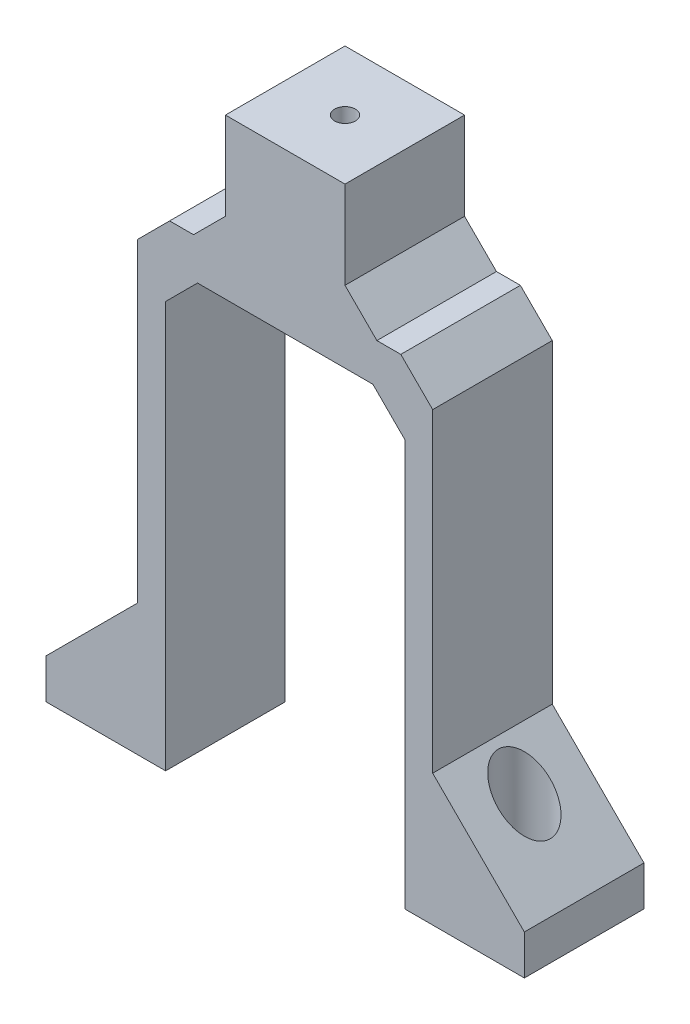
ISO-10303-21;
HEADER;
FILE_DESCRIPTION(('STEP AP214'),'2;1');
FILE_NAME('part.step','',(''),(''),'','','');
FILE_SCHEMA(('AUTOMOTIVE_DESIGN { 1 0 10303 214 1 1 1 1 }'));
ENDSEC;
DATA;
#1=APPLICATION_CONTEXT('core data for automotive mechanical design processes');
#2=APPLICATION_PROTOCOL_DEFINITION('international standard','automotive_design',2000,#1);
#3=PRODUCT_CONTEXT('',#1,'mechanical');
#4=PRODUCT('Part','Part','',(#3));
#5=PRODUCT_RELATED_PRODUCT_CATEGORY('part','',(#4));
#6=PRODUCT_DEFINITION_FORMATION('','',#4);
#7=PRODUCT_DEFINITION_CONTEXT('part definition',#1,'design');
#8=PRODUCT_DEFINITION('design','',#6,#7);
#9=PRODUCT_DEFINITION_SHAPE('','',#8);
#10=(LENGTH_UNIT() NAMED_UNIT(*) SI_UNIT(.MILLI.,.METRE.));
#11=(NAMED_UNIT(*) PLANE_ANGLE_UNIT() SI_UNIT($,.RADIAN.));
#12=(NAMED_UNIT(*) SI_UNIT($,.STERADIAN.) SOLID_ANGLE_UNIT());
#13=UNCERTAINTY_MEASURE_WITH_UNIT(LENGTH_MEASURE(1.E-05),#10,'distance_accuracy_value','');
#14=(GEOMETRIC_REPRESENTATION_CONTEXT(3) GLOBAL_UNCERTAINTY_ASSIGNED_CONTEXT((#13)) GLOBAL_UNIT_ASSIGNED_CONTEXT((#10,
#11,#12)) REPRESENTATION_CONTEXT('',''));
#15=CARTESIAN_POINT('',(0.,0.,0.));
#16=DIRECTION('',(0.,0.,1.));
#17=DIRECTION('',(1.,0.,0.));
#18=AXIS2_PLACEMENT_3D('',#15,#16,#17);
#19=CARTESIAN_POINT('',(-22.5,5.,0.));
#20=DIRECTION('',(0.,-1.,0.));
#21=DIRECTION('',(0.,0.,-1.));
#22=AXIS2_PLACEMENT_3D('',#19,#20,#21);
#23=CYLINDRICAL_SURFACE('',#22,1.875);
#24=CARTESIAN_POINT('',(-22.5,0.,0.));
#25=DIRECTION('',(0.,1.,0.));
#26=DIRECTION('',(0.,0.,1.));
#27=AXIS2_PLACEMENT_3D('',#24,#25,#26);
#28=CIRCLE('',#27,1.875);
#29=CARTESIAN_POINT('',(-22.5,0.,1.875));
#30=VERTEX_POINT('',#29);
#31=EDGE_CURVE('E295',#30,#30,#28,.T.);
#32=ORIENTED_EDGE('',*,*,#31,.F.);
#33=EDGE_LOOP('',(#32));
#34=FACE_BOUND('',#33,.T.);
#35=CARTESIAN_POINT('',(-22.5,3.,0.));
#36=DIRECTION('',(0.,1.,0.));
#37=DIRECTION('',(0.,0.,1.));
#38=AXIS2_PLACEMENT_3D('',#35,#36,#37);
#39=CIRCLE('',#38,1.875);
#40=CARTESIAN_POINT('',(-22.5,3.,1.875));
#41=VERTEX_POINT('',#40);
#42=EDGE_CURVE('E411',#41,#41,#39,.T.);
#43=ORIENTED_EDGE('',*,*,#42,.T.);
#44=EDGE_LOOP('',(#43));
#45=FACE_BOUND('',#44,.T.);
#46=ADVANCED_FACE('F41',(#34,#45),#23,.F.);
#47=CARTESIAN_POINT('',(22.5,5.,0.));
#48=DIRECTION('',(0.,-1.,0.));
#49=DIRECTION('',(0.,0.,-1.));
#50=AXIS2_PLACEMENT_3D('',#47,#48,#49);
#51=CYLINDRICAL_SURFACE('',#50,1.875);
#52=CARTESIAN_POINT('',(22.5,0.,0.));
#53=DIRECTION('',(0.,1.,0.));
#54=DIRECTION('',(0.,0.,1.));
#55=AXIS2_PLACEMENT_3D('',#52,#53,#54);
#56=CIRCLE('',#55,1.875);
#57=CARTESIAN_POINT('',(22.5,0.,1.875));
#58=VERTEX_POINT('',#57);
#59=EDGE_CURVE('E219',#58,#58,#56,.T.);
#60=ORIENTED_EDGE('',*,*,#59,.F.);
#61=EDGE_LOOP('',(#60));
#62=FACE_BOUND('',#61,.T.);
#63=CARTESIAN_POINT('',(22.5,3.,0.));
#64=DIRECTION('',(0.,1.,0.));
#65=DIRECTION('',(0.,0.,1.));
#66=AXIS2_PLACEMENT_3D('',#63,#64,#65);
#67=CIRCLE('',#66,1.875);
#68=CARTESIAN_POINT('',(22.5,3.,1.875));
#69=VERTEX_POINT('',#68);
#70=EDGE_CURVE('E407',#69,#69,#67,.T.);
#71=ORIENTED_EDGE('',*,*,#70,.T.);
#72=EDGE_LOOP('',(#71));
#73=FACE_BOUND('',#72,.T.);
#74=ADVANCED_FACE('F560',(#62,#73),#51,.F.);
#75=CARTESIAN_POINT('',(0.,60.,0.));
#76=DIRECTION('',(0.,-1.,0.));
#77=DIRECTION('',(0.,0.,-1.));
#78=AXIS2_PLACEMENT_3D('',#75,#76,#77);
#79=PLANE('',#78);
#80=DIRECTION('',(1.,0.,0.));
#81=VECTOR('',#80,1.);
#82=CARTESIAN_POINT('',(-18.5,60.,7.5));
#83=LINE('',#82,#81);
#84=CARTESIAN_POINT('',(11.5,60.,7.5));
#85=VERTEX_POINT('',#84);
#86=CARTESIAN_POINT('',(14.5,60.,7.5));
#87=VERTEX_POINT('',#86);
#88=EDGE_CURVE('E263',#85,#87,#83,.T.);
#89=ORIENTED_EDGE('',*,*,#88,.T.);
#90=DIRECTION('',(0.,0.,-1.));
#91=VECTOR('',#90,1.);
#92=CARTESIAN_POINT('',(14.5,60.,0.));
#93=LINE('',#92,#91);
#94=CARTESIAN_POINT('',(14.5,60.,-7.5));
#95=VERTEX_POINT('',#94);
#96=EDGE_CURVE('E355',#87,#95,#93,.T.);
#97=ORIENTED_EDGE('',*,*,#96,.T.);
#98=DIRECTION('',(-1.,0.,0.));
#99=VECTOR('',#98,1.);
#100=CARTESIAN_POINT('',(-18.5,60.,-7.5));
#101=LINE('',#100,#99);
#102=CARTESIAN_POINT('',(11.5,60.,-7.5));
#103=VERTEX_POINT('',#102);
#104=EDGE_CURVE('E269',#95,#103,#101,.T.);
#105=ORIENTED_EDGE('',*,*,#104,.T.);
#106=DIRECTION('',(0.,0.,1.));
#107=VECTOR('',#106,1.);
#108=CARTESIAN_POINT('',(11.5,60.,7.5));
#109=LINE('',#108,#107);
#110=EDGE_CURVE('E352',#103,#85,#109,.T.);
#111=ORIENTED_EDGE('',*,*,#110,.T.);
#112=EDGE_LOOP('',(#89,#97,#105,#111));
#113=FACE_BOUND('',#112,.T.);
#114=ADVANCED_FACE('F546',(#113),#79,.F.);
#115=CARTESIAN_POINT('',(-11.5,60.,-7.5));
#116=VERTEX_POINT('',#115);
#117=CARTESIAN_POINT('',(-14.5,60.,-7.5));
#118=VERTEX_POINT('',#117);
#119=EDGE_CURVE('E274',#116,#118,#101,.T.);
#120=ORIENTED_EDGE('',*,*,#119,.T.);
#121=DIRECTION('',(0.,0.,1.));
#122=VECTOR('',#121,1.);
#123=CARTESIAN_POINT('',(-14.5,60.,0.));
#124=LINE('',#123,#122);
#125=CARTESIAN_POINT('',(-14.5,60.,7.5));
#126=VERTEX_POINT('',#125);
#127=EDGE_CURVE('E333',#118,#126,#124,.T.);
#128=ORIENTED_EDGE('',*,*,#127,.T.);
#129=CARTESIAN_POINT('',(-11.5,60.,7.5));
#130=VERTEX_POINT('',#129);
#131=EDGE_CURVE('E267',#126,#130,#83,.T.);
#132=ORIENTED_EDGE('',*,*,#131,.T.);
#133=DIRECTION('',(0.,0.,-1.));
#134=VECTOR('',#133,1.);
#135=CARTESIAN_POINT('',(-11.5,60.,-7.5));
#136=LINE('',#135,#134);
#137=EDGE_CURVE('E330',#130,#116,#136,.T.);
#138=ORIENTED_EDGE('',*,*,#137,.T.);
#139=EDGE_LOOP('',(#120,#128,#132,#138));
#140=FACE_BOUND('',#139,.T.);
#141=ADVANCED_FACE('F474',(#140),#79,.F.);
#142=CARTESIAN_POINT('',(0.,55.,0.));
#143=DIRECTION('',(0.,-1.,0.));
#144=DIRECTION('',(0.,0.,-1.));
#145=AXIS2_PLACEMENT_3D('',#142,#143,#144);
#146=PLANE('',#145);
#147=CARTESIAN_POINT('',(0.,55.,0.));
#148=DIRECTION('',(0.,-1.,0.));
#149=DIRECTION('',(0.,0.,-1.));
#150=AXIS2_PLACEMENT_3D('',#147,#148,#149);
#151=CIRCLE('',#150,1.3);
#152=CARTESIAN_POINT('',(0.,55.,-1.3));
#153=VERTEX_POINT('',#152);
#154=EDGE_CURVE('E212',#153,#153,#151,.T.);
#155=ORIENTED_EDGE('',*,*,#154,.F.);
#156=EDGE_LOOP('',(#155));
#157=FACE_BOUND('',#156,.T.);
#158=DIRECTION('',(-1.,0.,0.));
#159=VECTOR('',#158,1.);
#160=CARTESIAN_POINT('',(-18.5,55.,-7.5));
#161=LINE('',#160,#159);
#162=CARTESIAN_POINT('',(11.,55.,-7.5));
#163=VERTEX_POINT('',#162);
#164=CARTESIAN_POINT('',(-11.,55.,-7.5));
#165=VERTEX_POINT('',#164);
#166=EDGE_CURVE('E268',#163,#165,#161,.T.);
#167=ORIENTED_EDGE('',*,*,#166,.F.);
#168=DIRECTION('',(0.,0.,1.));
#169=VECTOR('',#168,1.);
#170=CARTESIAN_POINT('',(11.,55.,0.));
#171=LINE('',#170,#169);
#172=CARTESIAN_POINT('',(11.,55.,7.5));
#173=VERTEX_POINT('',#172);
#174=EDGE_CURVE('E368',#163,#173,#171,.T.);
#175=ORIENTED_EDGE('',*,*,#174,.T.);
#176=DIRECTION('',(1.,0.,0.));
#177=VECTOR('',#176,1.);
#178=CARTESIAN_POINT('',(-18.5,55.,7.5));
#179=LINE('',#178,#177);
#180=CARTESIAN_POINT('',(-11.,55.,7.5));
#181=VERTEX_POINT('',#180);
#182=EDGE_CURVE('E262',#181,#173,#179,.T.);
#183=ORIENTED_EDGE('',*,*,#182,.F.);
#184=DIRECTION('',(0.,0.,-1.));
#185=VECTOR('',#184,1.);
#186=CARTESIAN_POINT('',(-11.,55.,0.));
#187=LINE('',#186,#185);
#188=EDGE_CURVE('E364',#181,#165,#187,.T.);
#189=ORIENTED_EDGE('',*,*,#188,.T.);
#190=EDGE_LOOP('',(#167,#175,#183,#189));
#191=FACE_BOUND('',#190,.T.);
#192=ADVANCED_FACE('F509',(#157,#191),#146,.T.);
#193=CARTESIAN_POINT('',(0.,0.,0.));
#194=DIRECTION('',(0.,-1.,0.));
#195=DIRECTION('',(0.,0.,-1.));
#196=AXIS2_PLACEMENT_3D('',#193,#194,#195);
#197=PLANE('',#196);
#198=DIRECTION('',(0.,0.,-1.));
#199=VECTOR('',#198,1.);
#200=CARTESIAN_POINT('',(-15.,0.,7.5));
#201=LINE('',#200,#199);
#202=CARTESIAN_POINT('',(-15.,0.,7.5));
#203=VERTEX_POINT('',#202);
#204=CARTESIAN_POINT('',(-15.,0.,-7.5));
#205=VERTEX_POINT('',#204);
#206=EDGE_CURVE('E299',#203,#205,#201,.T.);
#207=ORIENTED_EDGE('',*,*,#206,.F.);
#208=DIRECTION('',(1.,0.,0.));
#209=VECTOR('',#208,1.);
#210=CARTESIAN_POINT('',(-30.,0.,7.5));
#211=LINE('',#210,#209);
#212=CARTESIAN_POINT('',(-30.,0.,7.5));
#213=VERTEX_POINT('',#212);
#214=EDGE_CURVE('E304',#213,#203,#211,.T.);
#215=ORIENTED_EDGE('',*,*,#214,.F.);
#216=DIRECTION('',(0.,0.,1.));
#217=VECTOR('',#216,1.);
#218=CARTESIAN_POINT('',(-30.,0.,7.5));
#219=LINE('',#218,#217);
#220=CARTESIAN_POINT('',(-30.,0.,-7.5));
#221=VERTEX_POINT('',#220);
#222=EDGE_CURVE('E311',#221,#213,#219,.T.);
#223=ORIENTED_EDGE('',*,*,#222,.F.);
#224=DIRECTION('',(-1.,0.,0.));
#225=VECTOR('',#224,1.);
#226=CARTESIAN_POINT('',(-30.,0.,-7.5));
#227=LINE('',#226,#225);
#228=EDGE_CURVE('E308',#205,#221,#227,.T.);
#229=ORIENTED_EDGE('',*,*,#228,.F.);
#230=EDGE_LOOP('',(#207,#215,#223,#229));
#231=FACE_BOUND('',#230,.T.);
#232=ORIENTED_EDGE('',*,*,#31,.T.);
#233=EDGE_LOOP('',(#232));
#234=FACE_BOUND('',#233,.T.);
#235=ADVANCED_FACE('F495',(#231,#234),#197,.T.);
#236=CARTESIAN_POINT('',(-15.,5.,7.5));
#237=DIRECTION('',(-1.,0.,0.));
#238=DIRECTION('',(0.,0.,1.));
#239=AXIS2_PLACEMENT_3D('',#236,#237,#238);
#240=PLANE('',#239);
#241=DIRECTION('',(0.,-1.,0.));
#242=VECTOR('',#241,1.);
#243=CARTESIAN_POINT('',(-15.,5.,-7.5));
#244=LINE('',#243,#242);
#245=CARTESIAN_POINT('',(-15.,51.,-7.5));
#246=VERTEX_POINT('',#245);
#247=EDGE_CURVE('E327',#246,#205,#244,.T.);
#248=ORIENTED_EDGE('',*,*,#247,.F.);
#249=DIRECTION('',(0.,0.,1.));
#250=VECTOR('',#249,1.);
#251=CARTESIAN_POINT('',(-15.,51.,7.5));
#252=LINE('',#251,#250);
#253=CARTESIAN_POINT('',(-15.,51.,7.5));
#254=VERTEX_POINT('',#253);
#255=EDGE_CURVE('E375',#246,#254,#252,.T.);
#256=ORIENTED_EDGE('',*,*,#255,.T.);
#257=DIRECTION('',(0.,-1.,0.));
#258=VECTOR('',#257,1.);
#259=CARTESIAN_POINT('',(-15.,5.,7.5));
#260=LINE('',#259,#258);
#261=EDGE_CURVE('E303',#254,#203,#260,.T.);
#262=ORIENTED_EDGE('',*,*,#261,.T.);
#263=ORIENTED_EDGE('',*,*,#206,.T.);
#264=EDGE_LOOP('',(#248,#256,#262,#263));
#265=FACE_BOUND('',#264,.T.);
#266=ADVANCED_FACE('F500',(#265),#240,.F.);
#267=CARTESIAN_POINT('',(-30.,5.,-7.5));
#268=DIRECTION('',(0.,0.,1.));
#269=DIRECTION('',(1.,0.,0.));
#270=AXIS2_PLACEMENT_3D('',#267,#268,#269);
#271=PLANE('',#270);
#272=DIRECTION('',(0.,-1.,0.));
#273=VECTOR('',#272,1.);
#274=CARTESIAN_POINT('',(-18.5,55.,-7.5));
#275=LINE('',#274,#273);
#276=CARTESIAN_POINT('',(-18.5,56.,-7.5));
#277=VERTEX_POINT('',#276);
#278=CARTESIAN_POINT('',(-18.5,16.5000000000001,-7.5));
#279=VERTEX_POINT('',#278);
#280=EDGE_CURVE('E292',#277,#279,#275,.T.);
#281=ORIENTED_EDGE('',*,*,#280,.F.);
#282=DIRECTION('',(-0.707106781186546,-0.707106781186549,0.));
#283=VECTOR('',#282,1.);
#284=CARTESIAN_POINT('',(-14.5,60.,-7.5));
#285=LINE('',#284,#283);
#286=EDGE_CURVE('E349',#277,#118,#285,.F.);
#287=ORIENTED_EDGE('',*,*,#286,.T.);
#288=ORIENTED_EDGE('',*,*,#119,.F.);
#289=DIRECTION('',(-0.707106781186544,-0.707106781186551,0.));
#290=VECTOR('',#289,1.);
#291=CARTESIAN_POINT('',(-48.2499999999999,23.2499999999997,-7.5));
#292=LINE('',#291,#290);
#293=CARTESIAN_POINT('',(-7.5,64.,-7.5));
#294=VERTEX_POINT('',#293);
#295=EDGE_CURVE('E403',#116,#294,#292,.F.);
#296=ORIENTED_EDGE('',*,*,#295,.T.);
#297=DIRECTION('',(0.,-1.,0.));
#298=VECTOR('',#297,1.);
#299=CARTESIAN_POINT('',(-7.5,75.,-7.5));
#300=LINE('',#299,#298);
#301=CARTESIAN_POINT('',(-7.5,75.,-7.5));
#302=VERTEX_POINT('',#301);
#303=EDGE_CURVE('E197',#302,#294,#300,.T.);
#304=ORIENTED_EDGE('',*,*,#303,.F.);
#305=DIRECTION('',(-1.,0.,0.));
#306=VECTOR('',#305,1.);
#307=CARTESIAN_POINT('',(-7.5,75.,-7.5));
#308=LINE('',#307,#306);
#309=CARTESIAN_POINT('',(7.5,75.,-7.5));
#310=VERTEX_POINT('',#309);
#311=EDGE_CURVE('E191',#310,#302,#308,.T.);
#312=ORIENTED_EDGE('',*,*,#311,.F.);
#313=DIRECTION('',(0.,-1.,0.));
#314=VECTOR('',#313,1.);
#315=CARTESIAN_POINT('',(7.5,75.,-7.5));
#316=LINE('',#315,#314);
#317=CARTESIAN_POINT('',(7.5,64.,-7.5));
#318=VERTEX_POINT('',#317);
#319=EDGE_CURVE('E195',#310,#318,#316,.T.);
#320=ORIENTED_EDGE('',*,*,#319,.T.);
#321=DIRECTION('',(-0.707106781186544,0.707106781186551,0.));
#322=VECTOR('',#321,1.);
#323=CARTESIAN_POINT('',(18.2500000000002,53.2499999999997,-7.5));
#324=LINE('',#323,#322);
#325=EDGE_CURVE('E382',#318,#103,#324,.F.);
#326=ORIENTED_EDGE('',*,*,#325,.T.);
#327=ORIENTED_EDGE('',*,*,#104,.F.);
#328=DIRECTION('',(-0.707106781186546,0.707106781186549,0.));
#329=VECTOR('',#328,1.);
#330=CARTESIAN_POINT('',(14.5,60.,-7.5));
#331=LINE('',#330,#329);
#332=CARTESIAN_POINT('',(18.5,56.,-7.5));
#333=VERTEX_POINT('',#332);
#334=EDGE_CURVE('E346',#95,#333,#331,.F.);
#335=ORIENTED_EDGE('',*,*,#334,.T.);
#336=DIRECTION('',(0.,-1.,0.));
#337=VECTOR('',#336,1.);
#338=CARTESIAN_POINT('',(18.5,60.,-7.5));
#339=LINE('',#338,#337);
#340=CARTESIAN_POINT('',(18.5,16.5000000000001,-7.5));
#341=VERTEX_POINT('',#340);
#342=EDGE_CURVE('E273',#333,#341,#339,.T.);
#343=ORIENTED_EDGE('',*,*,#342,.T.);
#344=DIRECTION('',(-0.707106781186544,0.707106781186551,0.));
#345=VECTOR('',#344,1.);
#346=CARTESIAN_POINT('',(2.77555756156289E-13,35.,-7.5));
#347=LINE('',#346,#345);
#348=CARTESIAN_POINT('',(30.,5.,-7.5));
#349=VERTEX_POINT('',#348);
#350=EDGE_CURVE('E423',#341,#349,#347,.F.);
#351=ORIENTED_EDGE('',*,*,#350,.T.);
#352=DIRECTION('',(0.,-1.,0.));
#353=VECTOR('',#352,1.);
#354=CARTESIAN_POINT('',(30.,5.,-7.5));
#355=LINE('',#354,#353);
#356=CARTESIAN_POINT('',(30.,0.,-7.5));
#357=VERTEX_POINT('',#356);
#358=EDGE_CURVE('E258',#349,#357,#355,.T.);
#359=ORIENTED_EDGE('',*,*,#358,.T.);
#360=DIRECTION('',(-1.,0.,0.));
#361=VECTOR('',#360,1.);
#362=CARTESIAN_POINT('',(15.,0.,-7.5));
#363=LINE('',#362,#361);
#364=CARTESIAN_POINT('',(15.,0.,-7.5));
#365=VERTEX_POINT('',#364);
#366=EDGE_CURVE('E239',#357,#365,#363,.T.);
#367=ORIENTED_EDGE('',*,*,#366,.T.);
#368=DIRECTION('',(0.,-1.,0.));
#369=VECTOR('',#368,1.);
#370=CARTESIAN_POINT('',(15.,5.,-7.5));
#371=LINE('',#370,#369);
#372=CARTESIAN_POINT('',(15.,51.,-7.5));
#373=VERTEX_POINT('',#372);
#374=EDGE_CURVE('E255',#373,#365,#371,.T.);
#375=ORIENTED_EDGE('',*,*,#374,.F.);
#376=DIRECTION('',(-0.707106781186551,0.707106781186544,0.));
#377=VECTOR('',#376,1.);
#378=CARTESIAN_POINT('',(15.4999999999998,50.5000000000003,-7.5));
#379=LINE('',#378,#377);
#380=EDGE_CURVE('E391',#373,#163,#379,.T.);
#381=ORIENTED_EDGE('',*,*,#380,.T.);
#382=ORIENTED_EDGE('',*,*,#166,.T.);
#383=DIRECTION('',(-0.707106781186551,-0.707106781186544,0.));
#384=VECTOR('',#383,1.);
#385=CARTESIAN_POINT('',(-45.5000000000001,20.5000000000003,-7.5));
#386=LINE('',#385,#384);
#387=EDGE_CURVE('E394',#165,#246,#386,.T.);
#388=ORIENTED_EDGE('',*,*,#387,.T.);
#389=ORIENTED_EDGE('',*,*,#247,.T.);
#390=ORIENTED_EDGE('',*,*,#228,.T.);
#391=DIRECTION('',(0.,-1.,0.));
#392=VECTOR('',#391,1.);
#393=CARTESIAN_POINT('',(-30.,5.,-7.5));
#394=LINE('',#393,#392);
#395=CARTESIAN_POINT('',(-30.,5.,-7.5));
#396=VERTEX_POINT('',#395);
#397=EDGE_CURVE('E323',#396,#221,#394,.T.);
#398=ORIENTED_EDGE('',*,*,#397,.F.);
#399=DIRECTION('',(-0.707106781186544,-0.707106781186551,0.));
#400=VECTOR('',#399,1.);
#401=CARTESIAN_POINT('',(-30.,5.,-7.5));
#402=LINE('',#401,#400);
#403=EDGE_CURVE('E11',#396,#279,#402,.F.);
#404=ORIENTED_EDGE('',*,*,#403,.T.);
#405=EDGE_LOOP('',(#281,#287,#288,#296,#304,#312,#320,#326,#327,#335,#343,#351,#359,#367,#375,
#381,#382,#388,#389,#390,#398,#404));
#406=FACE_BOUND('',#405,.T.);
#407=ADVANCED_FACE('F193',(#406),#271,.F.);
#408=CARTESIAN_POINT('',(-30.,5.,7.5));
#409=DIRECTION('',(1.,0.,0.));
#410=DIRECTION('',(0.,0.,-1.));
#411=AXIS2_PLACEMENT_3D('',#408,#409,#410);
#412=PLANE('',#411);
#413=ORIENTED_EDGE('',*,*,#222,.T.);
#414=DIRECTION('',(0.,-1.,0.));
#415=VECTOR('',#414,1.);
#416=CARTESIAN_POINT('',(-30.,5.,7.5));
#417=LINE('',#416,#415);
#418=CARTESIAN_POINT('',(-30.,5.,7.5));
#419=VERTEX_POINT('',#418);
#420=EDGE_CURVE('E319',#419,#213,#417,.T.);
#421=ORIENTED_EDGE('',*,*,#420,.F.);
#422=DIRECTION('',(0.,0.,1.));
#423=VECTOR('',#422,1.);
#424=CARTESIAN_POINT('',(-30.,5.,7.5));
#425=LINE('',#424,#423);
#426=EDGE_CURVE('E300',#396,#419,#425,.T.);
#427=ORIENTED_EDGE('',*,*,#426,.F.);
#428=ORIENTED_EDGE('',*,*,#397,.T.);
#429=EDGE_LOOP('',(#413,#421,#427,#428));
#430=FACE_BOUND('',#429,.T.);
#431=ADVANCED_FACE('F489',(#430),#412,.F.);
#432=CARTESIAN_POINT('',(-30.,5.,7.5));
#433=DIRECTION('',(0.,0.,-1.));
#434=DIRECTION('',(-1.,0.,0.));
#435=AXIS2_PLACEMENT_3D('',#432,#433,#434);
#436=PLANE('',#435);
#437=ORIENTED_EDGE('',*,*,#131,.F.);
#438=DIRECTION('',(0.707106781186546,0.707106781186549,0.));
#439=VECTOR('',#438,1.);
#440=CARTESIAN_POINT('',(-14.5,60.,7.5));
#441=LINE('',#440,#439);
#442=CARTESIAN_POINT('',(-18.5,56.,7.5));
#443=VERTEX_POINT('',#442);
#444=EDGE_CURVE('E340',#126,#443,#441,.F.);
#445=ORIENTED_EDGE('',*,*,#444,.T.);
#446=DIRECTION('',(0.,-1.,0.));
#447=VECTOR('',#446,1.);
#448=CARTESIAN_POINT('',(-18.5,55.,7.5));
#449=LINE('',#448,#447);
#450=CARTESIAN_POINT('',(-18.5,16.5000000000001,7.5));
#451=VERTEX_POINT('',#450);
#452=EDGE_CURVE('E288',#443,#451,#449,.T.);
#453=ORIENTED_EDGE('',*,*,#452,.T.);
#454=DIRECTION('',(0.707106781186544,0.707106781186551,0.));
#455=VECTOR('',#454,1.);
#456=CARTESIAN_POINT('',(-30.,5.,7.5));
#457=LINE('',#456,#455);
#458=EDGE_CURVE('E51',#451,#419,#457,.F.);
#459=ORIENTED_EDGE('',*,*,#458,.T.);
#460=ORIENTED_EDGE('',*,*,#420,.T.);
#461=ORIENTED_EDGE('',*,*,#214,.T.);
#462=ORIENTED_EDGE('',*,*,#261,.F.);
#463=DIRECTION('',(0.707106781186551,0.707106781186544,0.));
#464=VECTOR('',#463,1.);
#465=CARTESIAN_POINT('',(-45.5000000000001,20.5000000000003,7.5));
#466=LINE('',#465,#464);
#467=EDGE_CURVE('E397',#254,#181,#466,.T.);
#468=ORIENTED_EDGE('',*,*,#467,.T.);
#469=ORIENTED_EDGE('',*,*,#182,.T.);
#470=DIRECTION('',(0.707106781186551,-0.707106781186544,0.));
#471=VECTOR('',#470,1.);
#472=CARTESIAN_POINT('',(15.4999999999998,50.5000000000003,7.5));
#473=LINE('',#472,#471);
#474=CARTESIAN_POINT('',(15.,51.,7.5));
#475=VERTEX_POINT('',#474);
#476=EDGE_CURVE('E388',#173,#475,#473,.T.);
#477=ORIENTED_EDGE('',*,*,#476,.T.);
#478=DIRECTION('',(0.,-1.,0.));
#479=VECTOR('',#478,1.);
#480=CARTESIAN_POINT('',(15.,5.,7.5));
#481=LINE('',#480,#479);
#482=CARTESIAN_POINT('',(15.,0.,7.5));
#483=VERTEX_POINT('',#482);
#484=EDGE_CURVE('E252',#475,#483,#481,.T.);
#485=ORIENTED_EDGE('',*,*,#484,.T.);
#486=DIRECTION('',(1.,0.,0.));
#487=VECTOR('',#486,1.);
#488=CARTESIAN_POINT('',(15.,0.,7.5));
#489=LINE('',#488,#487);
#490=CARTESIAN_POINT('',(30.,0.,7.5));
#491=VERTEX_POINT('',#490);
#492=EDGE_CURVE('E235',#483,#491,#489,.T.);
#493=ORIENTED_EDGE('',*,*,#492,.T.);
#494=DIRECTION('',(0.,-1.,0.));
#495=VECTOR('',#494,1.);
#496=CARTESIAN_POINT('',(30.,5.,7.5));
#497=LINE('',#496,#495);
#498=CARTESIAN_POINT('',(30.,5.,7.5));
#499=VERTEX_POINT('',#498);
#500=EDGE_CURVE('E234',#499,#491,#497,.T.);
#501=ORIENTED_EDGE('',*,*,#500,.F.);
#502=DIRECTION('',(0.707106781186544,-0.707106781186551,0.));
#503=VECTOR('',#502,1.);
#504=CARTESIAN_POINT('',(2.77555756156289E-13,35.,7.5));
#505=LINE('',#504,#503);
#506=CARTESIAN_POINT('',(18.5,16.5000000000001,7.5));
#507=VERTEX_POINT('',#506);
#508=EDGE_CURVE('E426',#499,#507,#505,.F.);
#509=ORIENTED_EDGE('',*,*,#508,.T.);
#510=DIRECTION('',(0.,-1.,0.));
#511=VECTOR('',#510,1.);
#512=CARTESIAN_POINT('',(18.5,60.,7.5));
#513=LINE('',#512,#511);
#514=CARTESIAN_POINT('',(18.5,56.,7.5));
#515=VERTEX_POINT('',#514);
#516=EDGE_CURVE('E284',#515,#507,#513,.T.);
#517=ORIENTED_EDGE('',*,*,#516,.F.);
#518=DIRECTION('',(0.707106781186546,-0.707106781186549,0.));
#519=VECTOR('',#518,1.);
#520=CARTESIAN_POINT('',(14.5,60.,7.5));
#521=LINE('',#520,#519);
#522=EDGE_CURVE('E337',#515,#87,#521,.F.);
#523=ORIENTED_EDGE('',*,*,#522,.T.);
#524=ORIENTED_EDGE('',*,*,#88,.F.);
#525=DIRECTION('',(0.707106781186544,-0.707106781186551,0.));
#526=VECTOR('',#525,1.);
#527=CARTESIAN_POINT('',(18.2500000000002,53.2499999999997,7.5));
#528=LINE('',#527,#526);
#529=CARTESIAN_POINT('',(7.5,64.,7.5));
#530=VERTEX_POINT('',#529);
#531=EDGE_CURVE('E385',#85,#530,#528,.F.);
#532=ORIENTED_EDGE('',*,*,#531,.T.);
#533=DIRECTION('',(0.,-1.,0.));
#534=VECTOR('',#533,1.);
#535=CARTESIAN_POINT('',(7.5,75.,7.5));
#536=LINE('',#535,#534);
#537=CARTESIAN_POINT('',(7.5,75.,7.5));
#538=VERTEX_POINT('',#537);
#539=EDGE_CURVE('E455',#538,#530,#536,.T.);
#540=ORIENTED_EDGE('',*,*,#539,.F.);
#541=DIRECTION('',(1.,0.,0.));
#542=VECTOR('',#541,1.);
#543=CARTESIAN_POINT('',(-7.5,75.,7.5));
#544=LINE('',#543,#542);
#545=CARTESIAN_POINT('',(-7.5,75.,7.5));
#546=VERTEX_POINT('',#545);
#547=EDGE_CURVE('E207',#546,#538,#544,.T.);
#548=ORIENTED_EDGE('',*,*,#547,.F.);
#549=DIRECTION('',(0.,-1.,0.));
#550=VECTOR('',#549,1.);
#551=CARTESIAN_POINT('',(-7.5,75.,7.5));
#552=LINE('',#551,#550);
#553=CARTESIAN_POINT('',(-7.5,64.,7.5));
#554=VERTEX_POINT('',#553);
#555=EDGE_CURVE('E226',#546,#554,#552,.T.);
#556=ORIENTED_EDGE('',*,*,#555,.T.);
#557=DIRECTION('',(0.707106781186544,0.707106781186551,0.));
#558=VECTOR('',#557,1.);
#559=CARTESIAN_POINT('',(-48.2499999999999,23.2499999999997,7.5));
#560=LINE('',#559,#558);
#561=EDGE_CURVE('E400',#554,#130,#560,.F.);
#562=ORIENTED_EDGE('',*,*,#561,.T.);
#563=EDGE_LOOP('',(#437,#445,#453,#459,#460,#461,#462,#468,#469,#477,#485,#493,#501,#509,#517,
#523,#524,#532,#540,#548,#556,#562));
#564=FACE_BOUND('',#563,.T.);
#565=ADVANCED_FACE('F462',(#564),#436,.F.);
#566=CARTESIAN_POINT('',(-18.5,55.,-7.5));
#567=DIRECTION('',(1.,0.,0.));
#568=DIRECTION('',(0.,0.,-1.));
#569=AXIS2_PLACEMENT_3D('',#566,#567,#568);
#570=PLANE('',#569);
#571=ORIENTED_EDGE('',*,*,#280,.T.);
#572=DIRECTION('',(0.,0.,1.));
#573=VECTOR('',#572,1.);
#574=CARTESIAN_POINT('',(-18.5,16.5000000000001,7.5));
#575=LINE('',#574,#573);
#576=EDGE_CURVE('E420',#279,#451,#575,.T.);
#577=ORIENTED_EDGE('',*,*,#576,.T.);
#578=ORIENTED_EDGE('',*,*,#452,.F.);
#579=DIRECTION('',(0.,0.,-1.));
#580=VECTOR('',#579,1.);
#581=CARTESIAN_POINT('',(-18.5,56.,-7.5));
#582=LINE('',#581,#580);
#583=EDGE_CURVE('E343',#443,#277,#582,.T.);
#584=ORIENTED_EDGE('',*,*,#583,.T.);
#585=EDGE_LOOP('',(#571,#577,#578,#584));
#586=FACE_BOUND('',#585,.T.);
#587=ADVANCED_FACE('F484',(#586),#570,.F.);
#588=CARTESIAN_POINT('',(18.5,60.,7.5));
#589=DIRECTION('',(-1.,0.,0.));
#590=DIRECTION('',(0.,0.,1.));
#591=AXIS2_PLACEMENT_3D('',#588,#589,#590);
#592=PLANE('',#591);
#593=ORIENTED_EDGE('',*,*,#516,.T.);
#594=DIRECTION('',(0.,0.,-1.));
#595=VECTOR('',#594,1.);
#596=CARTESIAN_POINT('',(18.5,16.5000000000001,-7.5));
#597=LINE('',#596,#595);
#598=EDGE_CURVE('E406',#507,#341,#597,.T.);
#599=ORIENTED_EDGE('',*,*,#598,.T.);
#600=ORIENTED_EDGE('',*,*,#342,.F.);
#601=DIRECTION('',(0.,0.,1.));
#602=VECTOR('',#601,1.);
#603=CARTESIAN_POINT('',(18.5,56.,7.5));
#604=LINE('',#603,#602);
#605=EDGE_CURVE('E359',#333,#515,#604,.T.);
#606=ORIENTED_EDGE('',*,*,#605,.T.);
#607=EDGE_LOOP('',(#593,#599,#600,#606));
#608=FACE_BOUND('',#607,.T.);
#609=ADVANCED_FACE('F537',(#608),#592,.F.);
#610=CARTESIAN_POINT('',(0.,0.,0.));
#611=DIRECTION('',(0.,-1.,0.));
#612=DIRECTION('',(0.,0.,-1.));
#613=AXIS2_PLACEMENT_3D('',#610,#611,#612);
#614=PLANE('',#613);
#615=DIRECTION('',(0.,0.,-1.));
#616=VECTOR('',#615,1.);
#617=CARTESIAN_POINT('',(30.,0.,7.5));
#618=LINE('',#617,#616);
#619=EDGE_CURVE('E224',#491,#357,#618,.T.);
#620=ORIENTED_EDGE('',*,*,#619,.F.);
#621=ORIENTED_EDGE('',*,*,#492,.F.);
#622=DIRECTION('',(0.,0.,1.));
#623=VECTOR('',#622,1.);
#624=CARTESIAN_POINT('',(15.,0.,7.5));
#625=LINE('',#624,#623);
#626=EDGE_CURVE('E243',#365,#483,#625,.T.);
#627=ORIENTED_EDGE('',*,*,#626,.F.);
#628=ORIENTED_EDGE('',*,*,#366,.F.);
#629=EDGE_LOOP('',(#620,#621,#627,#628));
#630=FACE_BOUND('',#629,.T.);
#631=ORIENTED_EDGE('',*,*,#59,.T.);
#632=EDGE_LOOP('',(#631));
#633=FACE_BOUND('',#632,.T.);
#634=ADVANCED_FACE('F523',(#630,#633),#614,.T.);
#635=CARTESIAN_POINT('',(30.,5.,7.5));
#636=DIRECTION('',(-1.,0.,0.));
#637=DIRECTION('',(0.,0.,1.));
#638=AXIS2_PLACEMENT_3D('',#635,#636,#637);
#639=PLANE('',#638);
#640=ORIENTED_EDGE('',*,*,#619,.T.);
#641=ORIENTED_EDGE('',*,*,#358,.F.);
#642=DIRECTION('',(0.,0.,-1.));
#643=VECTOR('',#642,1.);
#644=CARTESIAN_POINT('',(30.,5.,7.5));
#645=LINE('',#644,#643);
#646=EDGE_CURVE('E230',#499,#349,#645,.T.);
#647=ORIENTED_EDGE('',*,*,#646,.F.);
#648=ORIENTED_EDGE('',*,*,#500,.T.);
#649=EDGE_LOOP('',(#640,#641,#647,#648));
#650=FACE_BOUND('',#649,.T.);
#651=ADVANCED_FACE('F527',(#650),#639,.F.);
#652=CARTESIAN_POINT('',(15.,5.,7.5));
#653=DIRECTION('',(1.,0.,0.));
#654=DIRECTION('',(0.,0.,-1.));
#655=AXIS2_PLACEMENT_3D('',#652,#653,#654);
#656=PLANE('',#655);
#657=ORIENTED_EDGE('',*,*,#484,.F.);
#658=DIRECTION('',(0.,0.,-1.));
#659=VECTOR('',#658,1.);
#660=CARTESIAN_POINT('',(15.,51.,7.5));
#661=LINE('',#660,#659);
#662=EDGE_CURVE('E372',#475,#373,#661,.T.);
#663=ORIENTED_EDGE('',*,*,#662,.T.);
#664=ORIENTED_EDGE('',*,*,#374,.T.);
#665=ORIENTED_EDGE('',*,*,#626,.T.);
#666=EDGE_LOOP('',(#657,#663,#664,#665));
#667=FACE_BOUND('',#666,.T.);
#668=ADVANCED_FACE('F518',(#667),#656,.F.);
#669=CARTESIAN_POINT('',(7.5,75.,7.5));
#670=DIRECTION('',(-1.,0.,0.));
#671=DIRECTION('',(0.,0.,1.));
#672=AXIS2_PLACEMENT_3D('',#669,#670,#671);
#673=PLANE('',#672);
#674=ORIENTED_EDGE('',*,*,#539,.T.);
#675=DIRECTION('',(0.,0.,-1.));
#676=VECTOR('',#675,1.);
#677=CARTESIAN_POINT('',(7.5,64.,-7.5));
#678=LINE('',#677,#676);
#679=EDGE_CURVE('E217',#530,#318,#678,.T.);
#680=ORIENTED_EDGE('',*,*,#679,.T.);
#681=ORIENTED_EDGE('',*,*,#319,.F.);
#682=DIRECTION('',(0.,0.,-1.));
#683=VECTOR('',#682,1.);
#684=CARTESIAN_POINT('',(7.5,75.,7.5));
#685=LINE('',#684,#683);
#686=EDGE_CURVE('E202',#538,#310,#685,.T.);
#687=ORIENTED_EDGE('',*,*,#686,.F.);
#688=EDGE_LOOP('',(#674,#680,#681,#687));
#689=FACE_BOUND('',#688,.T.);
#690=ADVANCED_FACE('F215',(#689),#673,.F.);
#691=CARTESIAN_POINT('',(-7.5,75.,7.5));
#692=DIRECTION('',(1.,0.,0.));
#693=DIRECTION('',(0.,0.,-1.));
#694=AXIS2_PLACEMENT_3D('',#691,#692,#693);
#695=PLANE('',#694);
#696=ORIENTED_EDGE('',*,*,#303,.T.);
#697=DIRECTION('',(0.,0.,1.));
#698=VECTOR('',#697,1.);
#699=CARTESIAN_POINT('',(-7.5,64.,7.5));
#700=LINE('',#699,#698);
#701=EDGE_CURVE('E378',#294,#554,#700,.T.);
#702=ORIENTED_EDGE('',*,*,#701,.T.);
#703=ORIENTED_EDGE('',*,*,#555,.F.);
#704=DIRECTION('',(0.,0.,1.));
#705=VECTOR('',#704,1.);
#706=CARTESIAN_POINT('',(-7.5,75.,7.5));
#707=LINE('',#706,#705);
#708=EDGE_CURVE('E201',#302,#546,#707,.T.);
#709=ORIENTED_EDGE('',*,*,#708,.F.);
#710=EDGE_LOOP('',(#696,#702,#703,#709));
#711=FACE_BOUND('',#710,.T.);
#712=ADVANCED_FACE('F465',(#711),#695,.F.);
#713=CARTESIAN_POINT('',(0.,75.,0.));
#714=DIRECTION('',(0.,-1.,0.));
#715=DIRECTION('',(0.,0.,-1.));
#716=AXIS2_PLACEMENT_3D('',#713,#714,#715);
#717=PLANE('',#716);
#718=CARTESIAN_POINT('',(0.,75.,0.));
#719=DIRECTION('',(0.,1.,0.));
#720=DIRECTION('',(0.,0.,1.));
#721=AXIS2_PLACEMENT_3D('',#718,#719,#720);
#722=CIRCLE('',#721,1.3);
#723=CARTESIAN_POINT('',(0.,75.,1.3));
#724=VERTEX_POINT('',#723);
#725=EDGE_CURVE('E416',#724,#724,#722,.T.);
#726=ORIENTED_EDGE('',*,*,#725,.F.);
#727=EDGE_LOOP('',(#726));
#728=FACE_BOUND('',#727,.T.);
#729=ORIENTED_EDGE('',*,*,#686,.T.);
#730=ORIENTED_EDGE('',*,*,#311,.T.);
#731=ORIENTED_EDGE('',*,*,#708,.T.);
#732=ORIENTED_EDGE('',*,*,#547,.T.);
#733=EDGE_LOOP('',(#729,#730,#731,#732));
#734=FACE_BOUND('',#733,.T.);
#735=ADVANCED_FACE('F205',(#728,#734),#717,.F.);
#736=CARTESIAN_POINT('',(0.,0.,0.));
#737=DIRECTION('',(0.,1.,0.));
#738=DIRECTION('',(0.,0.,1.));
#739=AXIS2_PLACEMENT_3D('',#736,#737,#738);
#740=CYLINDRICAL_SURFACE('',#739,1.3);
#741=ORIENTED_EDGE('',*,*,#154,.T.);
#742=EDGE_LOOP('',(#741));
#743=FACE_BOUND('',#742,.T.);
#744=ORIENTED_EDGE('',*,*,#725,.T.);
#745=EDGE_LOOP('',(#744));
#746=FACE_BOUND('',#745,.T.);
#747=ADVANCED_FACE('F584',(#743,#746),#740,.F.);
#748=CARTESIAN_POINT('',(-14.5,60.,0.));
#749=DIRECTION('',(0.707106781186549,-0.707106781186546,0.));
#750=DIRECTION('',(0.,0.,1.));
#751=AXIS2_PLACEMENT_3D('',#748,#749,#750);
#752=PLANE('',#751);
#753=ORIENTED_EDGE('',*,*,#286,.F.);
#754=ORIENTED_EDGE('',*,*,#583,.F.);
#755=ORIENTED_EDGE('',*,*,#444,.F.);
#756=ORIENTED_EDGE('',*,*,#127,.F.);
#757=EDGE_LOOP('',(#753,#754,#755,#756));
#758=FACE_BOUND('',#757,.T.);
#759=ADVANCED_FACE('F481',(#758),#752,.F.);
#760=CARTESIAN_POINT('',(14.5,60.,0.));
#761=DIRECTION('',(-0.707106781186549,-0.707106781186546,0.));
#762=DIRECTION('',(0.,0.,-1.));
#763=AXIS2_PLACEMENT_3D('',#760,#761,#762);
#764=PLANE('',#763);
#765=ORIENTED_EDGE('',*,*,#522,.F.);
#766=ORIENTED_EDGE('',*,*,#605,.F.);
#767=ORIENTED_EDGE('',*,*,#334,.F.);
#768=ORIENTED_EDGE('',*,*,#96,.F.);
#769=EDGE_LOOP('',(#765,#766,#767,#768));
#770=FACE_BOUND('',#769,.T.);
#771=ADVANCED_FACE('F541',(#770),#764,.F.);
#772=CARTESIAN_POINT('',(7.5,64.,7.5));
#773=DIRECTION('',(0.707106781186551,0.707106781186544,0.));
#774=DIRECTION('',(0.,0.,1.));
#775=AXIS2_PLACEMENT_3D('',#772,#773,#774);
#776=PLANE('',#775);
#777=ORIENTED_EDGE('',*,*,#531,.F.);
#778=ORIENTED_EDGE('',*,*,#110,.F.);
#779=ORIENTED_EDGE('',*,*,#325,.F.);
#780=ORIENTED_EDGE('',*,*,#679,.F.);
#781=EDGE_LOOP('',(#777,#778,#779,#780));
#782=FACE_BOUND('',#781,.T.);
#783=ADVANCED_FACE('F550',(#782),#776,.T.);
#784=CARTESIAN_POINT('',(11.,55.,0.));
#785=DIRECTION('',(0.707106781186544,0.707106781186551,0.));
#786=DIRECTION('',(0.,0.,1.));
#787=AXIS2_PLACEMENT_3D('',#784,#785,#786);
#788=PLANE('',#787);
#789=ORIENTED_EDGE('',*,*,#380,.F.);
#790=ORIENTED_EDGE('',*,*,#662,.F.);
#791=ORIENTED_EDGE('',*,*,#476,.F.);
#792=ORIENTED_EDGE('',*,*,#174,.F.);
#793=EDGE_LOOP('',(#789,#790,#791,#792));
#794=FACE_BOUND('',#793,.T.);
#795=ADVANCED_FACE('F515',(#794),#788,.F.);
#796=CARTESIAN_POINT('',(-11.,55.,0.));
#797=DIRECTION('',(-0.707106781186544,0.707106781186551,0.));
#798=DIRECTION('',(0.,0.,-1.));
#799=AXIS2_PLACEMENT_3D('',#796,#797,#798);
#800=PLANE('',#799);
#801=ORIENTED_EDGE('',*,*,#467,.F.);
#802=ORIENTED_EDGE('',*,*,#255,.F.);
#803=ORIENTED_EDGE('',*,*,#387,.F.);
#804=ORIENTED_EDGE('',*,*,#188,.F.);
#805=EDGE_LOOP('',(#801,#802,#803,#804));
#806=FACE_BOUND('',#805,.T.);
#807=ADVANCED_FACE('F506',(#806),#800,.F.);
#808=CARTESIAN_POINT('',(-7.5,64.,7.5));
#809=DIRECTION('',(-0.707106781186551,0.707106781186544,0.));
#810=DIRECTION('',(0.,0.,-1.));
#811=AXIS2_PLACEMENT_3D('',#808,#809,#810);
#812=PLANE('',#811);
#813=ORIENTED_EDGE('',*,*,#295,.F.);
#814=ORIENTED_EDGE('',*,*,#137,.F.);
#815=ORIENTED_EDGE('',*,*,#561,.F.);
#816=ORIENTED_EDGE('',*,*,#701,.F.);
#817=EDGE_LOOP('',(#813,#814,#815,#816));
#818=FACE_BOUND('',#817,.T.);
#819=ADVANCED_FACE('F469',(#818),#812,.T.);
#820=CARTESIAN_POINT('',(22.5,3.,0.));
#821=DIRECTION('',(0.,1.,0.));
#822=DIRECTION('',(0.,0.,1.));
#823=AXIS2_PLACEMENT_3D('',#820,#821,#822);
#824=CYLINDRICAL_SURFACE('',#823,3.25);
#825=CARTESIAN_POINT('',(22.5,3.,0.));
#826=DIRECTION('',(0.,1.,0.));
#827=DIRECTION('',(0.,0.,1.));
#828=AXIS2_PLACEMENT_3D('',#825,#826,#827);
#829=CIRCLE('',#828,3.25);
#830=CARTESIAN_POINT('',(22.5,3.,3.25));
#831=VERTEX_POINT('',#830);
#832=EDGE_CURVE('E433',#831,#831,#829,.T.);
#833=ORIENTED_EDGE('',*,*,#832,.F.);
#834=EDGE_LOOP('',(#833));
#835=FACE_BOUND('',#834,.T.);
#836=CARTESIAN_POINT('',(22.5,12.5,0.));
#837=DIRECTION('',(0.707106781186551,0.707106781186544,0.));
#838=DIRECTION('',(-0.707106781186544,0.707106781186551,0.));
#839=AXIS2_PLACEMENT_3D('',#836,#837,#838);
#840=ELLIPSE('',#839,4.59619407771258,3.25);
#841=CARTESIAN_POINT('',(19.25,15.7500000000001,0.));
#842=VERTEX_POINT('',#841);
#843=EDGE_CURVE('E430',#842,#842,#840,.T.);
#844=ORIENTED_EDGE('',*,*,#843,.T.);
#845=EDGE_LOOP('',(#844));
#846=FACE_BOUND('',#845,.T.);
#847=ADVANCED_FACE('F597',(#835,#846),#824,.F.);
#848=CARTESIAN_POINT('',(22.5,3.,0.));
#849=DIRECTION('',(0.,1.,0.));
#850=DIRECTION('',(0.,0.,1.));
#851=AXIS2_PLACEMENT_3D('',#848,#849,#850);
#852=PLANE('',#851);
#853=ORIENTED_EDGE('',*,*,#70,.F.);
#854=EDGE_LOOP('',(#853));
#855=FACE_BOUND('',#854,.T.);
#856=ORIENTED_EDGE('',*,*,#832,.T.);
#857=EDGE_LOOP('',(#856));
#858=FACE_BOUND('',#857,.T.);
#859=ADVANCED_FACE('F669',(#855,#858),#852,.T.);
#860=CARTESIAN_POINT('',(-22.5,3.,0.));
#861=DIRECTION('',(0.,1.,0.));
#862=DIRECTION('',(0.,0.,1.));
#863=AXIS2_PLACEMENT_3D('',#860,#861,#862);
#864=CYLINDRICAL_SURFACE('',#863,3.25);
#865=CARTESIAN_POINT('',(-22.5,3.,0.));
#866=DIRECTION('',(0.,1.,0.));
#867=DIRECTION('',(0.,0.,1.));
#868=AXIS2_PLACEMENT_3D('',#865,#866,#867);
#869=CIRCLE('',#868,3.25);
#870=CARTESIAN_POINT('',(-22.5,3.,3.25));
#871=VERTEX_POINT('',#870);
#872=EDGE_CURVE('E412',#871,#871,#869,.T.);
#873=ORIENTED_EDGE('',*,*,#872,.F.);
#874=EDGE_LOOP('',(#873));
#875=FACE_BOUND('',#874,.T.);
#876=CARTESIAN_POINT('',(-22.5,12.5,0.));
#877=DIRECTION('',(-0.707106781186551,0.707106781186544,0.));
#878=DIRECTION('',(0.707106781186544,0.707106781186551,0.));
#879=AXIS2_PLACEMENT_3D('',#876,#877,#878);
#880=ELLIPSE('',#879,4.59619407771258,3.25);
#881=CARTESIAN_POINT('',(-19.25,15.7500000000001,0.));
#882=VERTEX_POINT('',#881);
#883=EDGE_CURVE('E45',#882,#882,#880,.T.);
#884=ORIENTED_EDGE('',*,*,#883,.T.);
#885=EDGE_LOOP('',(#884));
#886=FACE_BOUND('',#885,.T.);
#887=ADVANCED_FACE('F673',(#875,#886),#864,.F.);
#888=CARTESIAN_POINT('',(-22.5,3.,0.));
#889=DIRECTION('',(0.,1.,0.));
#890=DIRECTION('',(0.,0.,1.));
#891=AXIS2_PLACEMENT_3D('',#888,#889,#890);
#892=PLANE('',#891);
#893=ORIENTED_EDGE('',*,*,#42,.F.);
#894=EDGE_LOOP('',(#893));
#895=FACE_BOUND('',#894,.T.);
#896=ORIENTED_EDGE('',*,*,#872,.T.);
#897=EDGE_LOOP('',(#896));
#898=FACE_BOUND('',#897,.T.);
#899=ADVANCED_FACE('F682',(#895,#898),#892,.T.);
#900=CARTESIAN_POINT('',(18.5,16.5000000000001,7.5));
#901=DIRECTION('',(0.707106781186551,0.707106781186544,0.));
#902=DIRECTION('',(0.,0.,1.));
#903=AXIS2_PLACEMENT_3D('',#900,#901,#902);
#904=PLANE('',#903);
#905=ORIENTED_EDGE('',*,*,#508,.F.);
#906=ORIENTED_EDGE('',*,*,#646,.T.);
#907=ORIENTED_EDGE('',*,*,#350,.F.);
#908=ORIENTED_EDGE('',*,*,#598,.F.);
#909=EDGE_LOOP('',(#905,#906,#907,#908));
#910=FACE_BOUND('',#909,.T.);
#911=ORIENTED_EDGE('',*,*,#843,.F.);
#912=EDGE_LOOP('',(#911));
#913=FACE_BOUND('',#912,.T.);
#914=ADVANCED_FACE('F532',(#910,#913),#904,.T.);
#915=CARTESIAN_POINT('',(-18.5,16.5000000000001,-7.5));
#916=DIRECTION('',(-0.707106781186551,0.707106781186544,0.));
#917=DIRECTION('',(0.,0.,-1.));
#918=AXIS2_PLACEMENT_3D('',#915,#916,#917);
#919=PLANE('',#918);
#920=ORIENTED_EDGE('',*,*,#403,.F.);
#921=ORIENTED_EDGE('',*,*,#426,.T.);
#922=ORIENTED_EDGE('',*,*,#458,.F.);
#923=ORIENTED_EDGE('',*,*,#576,.F.);
#924=EDGE_LOOP('',(#920,#921,#922,#923));
#925=FACE_BOUND('',#924,.T.);
#926=ORIENTED_EDGE('',*,*,#883,.F.);
#927=EDGE_LOOP('',(#926));
#928=FACE_BOUND('',#927,.T.);
#929=ADVANCED_FACE('F43',(#925,#928),#919,.T.);
#930=CLOSED_SHELL('',(#46,#74,#114,#141,#192,#235,#266,#407,#431,#565,#587,#609,#634,#651,#668,
#690,#712,#735,#747,#759,#771,#783,#795,#807,#819,#847,#859,#887,#899,#914,#929));
#931=MANIFOLD_SOLID_BREP('B2',#930);
#932=ADVANCED_BREP_SHAPE_REPRESENTATION('',(#18,#931),#14);
#933=SHAPE_DEFINITION_REPRESENTATION(#9,#932);
ENDSEC;
END-ISO-10303-21;
